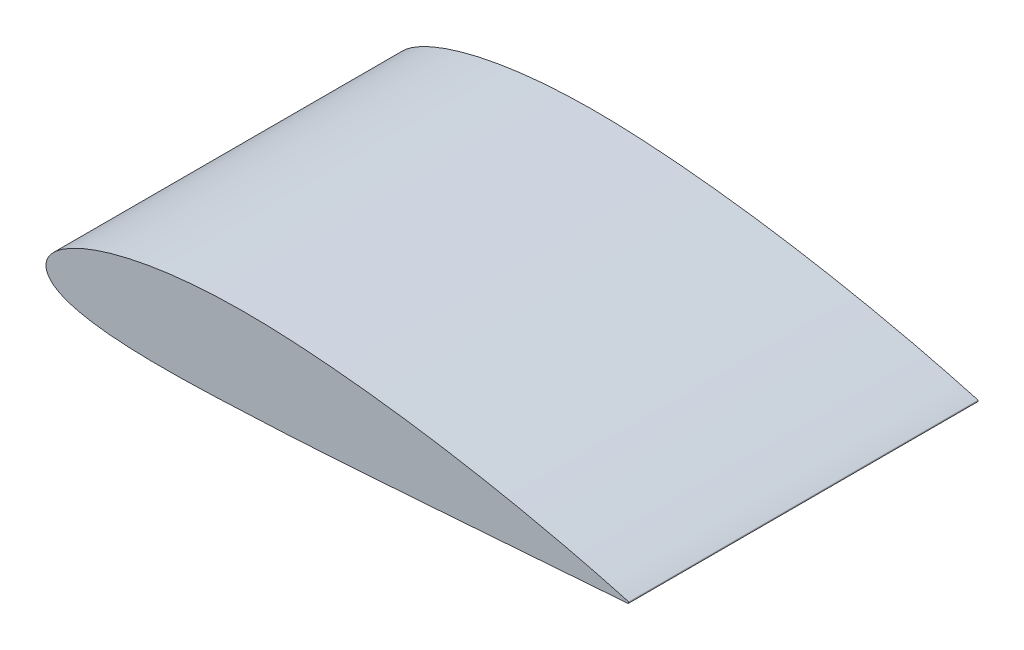
ISO-10303-21;
HEADER;
FILE_DESCRIPTION(('STEP AP214'),'2;1');
FILE_NAME('part.step','',(''),(''),'','','');
FILE_SCHEMA(('AUTOMOTIVE_DESIGN { 1 0 10303 214 1 1 1 1 }'));
ENDSEC;
DATA;
#1=APPLICATION_CONTEXT('core data for automotive mechanical design processes');
#2=APPLICATION_PROTOCOL_DEFINITION('international standard','automotive_design',2000,#1);
#3=PRODUCT_CONTEXT('',#1,'mechanical');
#4=PRODUCT('Part','Part','',(#3));
#5=PRODUCT_RELATED_PRODUCT_CATEGORY('part','',(#4));
#6=PRODUCT_DEFINITION_FORMATION('','',#4);
#7=PRODUCT_DEFINITION_CONTEXT('part definition',#1,'design');
#8=PRODUCT_DEFINITION('design','',#6,#7);
#9=PRODUCT_DEFINITION_SHAPE('','',#8);
#10=(LENGTH_UNIT() NAMED_UNIT(*) SI_UNIT(.MILLI.,.METRE.));
#11=(NAMED_UNIT(*) PLANE_ANGLE_UNIT() SI_UNIT($,.RADIAN.));
#12=(NAMED_UNIT(*) SI_UNIT($,.STERADIAN.) SOLID_ANGLE_UNIT());
#13=UNCERTAINTY_MEASURE_WITH_UNIT(LENGTH_MEASURE(1.E-05),#10,'distance_accuracy_value','');
#14=(GEOMETRIC_REPRESENTATION_CONTEXT(3) GLOBAL_UNCERTAINTY_ASSIGNED_CONTEXT((#13)) GLOBAL_UNIT_ASSIGNED_CONTEXT((#10,
#11,#12)) REPRESENTATION_CONTEXT('',''));
#15=CARTESIAN_POINT('',(0.,0.,0.));
#16=DIRECTION('',(0.,0.,1.));
#17=DIRECTION('',(1.,0.,0.));
#18=AXIS2_PLACEMENT_3D('',#15,#16,#17);
#19=CARTESIAN_POINT('',(182.405782768369,1.47905887254487,90.));
#20=CARTESIAN_POINT('',(182.394349994322,1.48372425629736,90.));
#21=CARTESIAN_POINT('',(182.344101455476,1.49405103882799,90.));
#22=CARTESIAN_POINT('',(182.236733802167,1.52728747378235,90.));
#23=CARTESIAN_POINT('',(182.054061505761,1.57563660834943,90.));
#24=CARTESIAN_POINT('',(181.800427645339,1.64672865772037,90.));
#25=CARTESIAN_POINT('',(181.473867299204,1.73599349451242,90.));
#26=CARTESIAN_POINT('',(181.07569175812,1.84544026952493,90.));
#27=CARTESIAN_POINT('',(180.605776404599,1.9734699954532,90.));
#28=CARTESIAN_POINT('',(180.064742529011,2.12060769088526,90.));
#29=CARTESIAN_POINT('',(179.452928079381,2.28555656581342,90.));
#30=CARTESIAN_POINT('',(178.770992549194,2.46856564449632,90.));
#31=CARTESIAN_POINT('',(178.019548809164,2.66877198429473,90.));
#32=CARTESIAN_POINT('',(177.199129769294,2.88536417344557,90.));
#33=CARTESIAN_POINT('',(176.310605643542,3.11833760049978,90.));
#34=CARTESIAN_POINT('',(175.354600183865,3.36641987870612,90.));
#35=CARTESIAN_POINT('',(174.332087200887,3.62933214594554,90.));
#36=CARTESIAN_POINT('',(173.244022100583,3.90615436409724,90.));
#37=CARTESIAN_POINT('',(172.091272620534,4.19600298977877,90.));
#38=CARTESIAN_POINT('',(170.874985691767,4.49841508904265,90.));
#39=CARTESIAN_POINT('',(169.596111240064,4.81203148279891,90.));
#40=CARTESIAN_POINT('',(168.255990608515,5.13673088238005,90.));
#41=CARTESIAN_POINT('',(166.855735714666,5.47093736669246,90.));
#42=CARTESIAN_POINT('',(165.39669391933,5.81436054641426,90.));
#43=CARTESIAN_POINT('',(163.880180353068,6.16579326381626,90.));
#44=CARTESIAN_POINT('',(162.307605326419,6.52454333882902,90.));
#45=CARTESIAN_POINT('',(160.680390360764,6.88936244389329,90.));
#46=CARTESIAN_POINT('',(159.000134791776,7.25974115304893,90.));
#47=CARTESIAN_POINT('',(157.268310059528,7.63442556607595,90.));
#48=CARTESIAN_POINT('',(155.486600614097,8.0126173651943,90.));
#49=CARTESIAN_POINT('',(153.656704995922,8.39340896793512,90.));
#50=CARTESIAN_POINT('',(151.780349397806,8.77598090676935,90.));
#51=CARTESIAN_POINT('',(149.859255683824,9.15904161347765,90.));
#52=CARTESIAN_POINT('',(147.895334813072,9.54219591278912,90.));
#53=CARTESIAN_POINT('',(145.89040427615,9.92412946160072,90.));
#54=CARTESIAN_POINT('',(143.846373090577,10.3039729000445,90.));
#55=CARTESIAN_POINT('',(141.765319372205,10.6812079835119,90.));
#56=CARTESIAN_POINT('',(139.649198882249,11.0543715740264,90.));
#57=CARTESIAN_POINT('',(137.500025553508,11.4226182746895,90.));
#58=CARTESIAN_POINT('',(135.319921643493,11.7855286376255,90.));
#59=CARTESIAN_POINT('',(133.110982904104,12.1418922281903,90.));
#60=CARTESIAN_POINT('',(130.875399053286,12.4906825727177,90.));
#61=CARTESIAN_POINT('',(128.615391045887,12.831174427331,90.));
#62=CARTESIAN_POINT('',(126.333137400247,13.1627236719134,90.));
#63=CARTESIAN_POINT('',(124.030878822672,13.4840714224213,90.));
#64=CARTESIAN_POINT('',(121.710956010234,13.7946426848218,90.));
#65=CARTESIAN_POINT('',(119.375684343862,14.0937283784633,90.));
#66=CARTESIAN_POINT('',(117.027363699594,14.3800866863343,90.));
#67=CARTESIAN_POINT('',(114.668319434302,14.6530947519702,90.));
#68=CARTESIAN_POINT('',(112.30103513908,14.9122826013609,90.));
#69=CARTESIAN_POINT('',(109.927737110567,15.156256099332,90.));
#70=CARTESIAN_POINT('',(107.55096560803,15.3850561259669,90.));
#71=CARTESIAN_POINT('',(105.173031682702,15.5971194086904,90.));
#72=CARTESIAN_POINT('',(102.796452216973,15.7924089941574,90.));
#73=CARTESIAN_POINT('',(100.423600801908,15.9700207397933,90.));
#74=CARTESIAN_POINT('',(98.0569177245874,16.1291368833698,90.));
#75=CARTESIAN_POINT('',(95.6988195044822,16.2693925063235,90.));
#76=CARTESIAN_POINT('',(93.3449586508391,16.3908611866141,90.));
#77=CARTESIAN_POINT('',(90.9928600278273,16.4913934499471,90.));
#78=CARTESIAN_POINT('',(88.6446894481208,16.562898483121,90.));
#79=CARTESIAN_POINT('',(86.3099312214749,16.6066549323737,90.));
#80=CARTESIAN_POINT('',(83.9958596278902,16.6219922808504,90.));
#81=CARTESIAN_POINT('',(81.7050822348194,16.6084257444218,90.));
#82=CARTESIAN_POINT('',(79.4401924537075,16.5666378978566,90.));
#83=CARTESIAN_POINT('',(77.2036900884527,16.4962234448997,90.));
#84=CARTESIAN_POINT('',(74.9981434299177,16.3972442197981,90.));
#85=CARTESIAN_POINT('',(72.8259465417015,16.2708168728597,90.));
#86=CARTESIAN_POINT('',(70.6896343419326,16.1160103431971,90.));
#87=CARTESIAN_POINT('',(68.5914531396264,15.9345619607085,90.));
#88=CARTESIAN_POINT('',(66.5338998473421,15.7259207837486,90.));
#89=CARTESIAN_POINT('',(64.5191839739808,15.4915145869629,90.));
#90=CARTESIAN_POINT('',(62.5496264703357,15.2314242833866,90.));
#91=CARTESIAN_POINT('',(60.6273129456703,14.9468451533976,90.));
#92=CARTESIAN_POINT('',(58.754400617675,14.6382647216605,90.));
#93=CARTESIAN_POINT('',(56.9329880522266,14.3069601416694,90.));
#94=CARTESIAN_POINT('',(55.1649516986086,13.9539255124746,90.));
#95=CARTESIAN_POINT('',(53.452336046637,13.5797604316655,90.));
#96=CARTESIAN_POINT('',(51.7968073296944,13.1861080557181,90.));
#97=CARTESIAN_POINT('',(50.2002168841034,12.7737056277228,90.));
#98=CARTESIAN_POINT('',(48.6641745218393,12.3440406910151,90.));
#99=CARTESIAN_POINT('',(47.190292187113,11.8981112594572,90.));
#100=CARTESIAN_POINT('',(45.7800773272546,11.4373520929544,90.));
#101=CARTESIAN_POINT('',(44.4348503719299,10.9631158583816,90.));
#102=CARTESIAN_POINT('',(43.1558843447423,10.4766727417222,90.));
#103=CARTESIAN_POINT('',(41.9445259254619,9.97905808919306,90.));
#104=CARTESIAN_POINT('',(40.8018086148333,9.47194095377795,90.));
#105=CARTESIAN_POINT('',(39.7288141175969,8.95637411153487,90.));
#106=CARTESIAN_POINT('',(38.7264399634006,8.43368601103471,90.));
#107=CARTESIAN_POINT('',(37.795433801707,7.90517984154916,90.));
#108=CARTESIAN_POINT('',(36.9367754656936,7.37175407985075,90.));
#109=CARTESIAN_POINT('',(36.1507716151831,6.83502425265779,90.));
#110=CARTESIAN_POINT('',(35.4383977276523,6.29550465004045,90.));
#111=CARTESIAN_POINT('',(34.7997262776407,5.75469005088498,90.));
#112=CARTESIAN_POINT('',(34.2357420875747,5.21280033058309,90.));
#113=CARTESIAN_POINT('',(33.7459534276668,4.67143862798895,90.));
#114=CARTESIAN_POINT('',(33.331331255168,4.13054834072201,90.));
#115=CARTESIAN_POINT('',(32.9918484981616,3.59098912624162,90.));
#116=CARTESIAN_POINT('',(32.7277381167382,3.05315284259431,90.));
#117=CARTESIAN_POINT('',(32.5398370115619,2.51729597951501,90.));
#118=CARTESIAN_POINT('',(32.4278545636237,1.98407531023235,90.));
#119=CARTESIAN_POINT('',(32.3932251684,1.45397314220587,90.));
#120=CARTESIAN_POINT('',(32.4347718188925,0.930316799243013,90.));
#121=CARTESIAN_POINT('',(32.5507287367132,0.418010144024002,90.));
#122=CARTESIAN_POINT('',(32.7410874573582,-0.0776789337837974,90.));
#123=CARTESIAN_POINT('',(33.0043989705735,-0.554000674715616,90.));
#124=CARTESIAN_POINT('',(33.3399622816249,-1.01059796074396,90.));
#125=CARTESIAN_POINT('',(33.7465429600042,-1.44760495230936,90.));
#126=CARTESIAN_POINT('',(34.223192032798,-1.86525165553163,90.));
#127=CARTESIAN_POINT('',(34.7692344511436,-2.26352437805988,90.));
#128=CARTESIAN_POINT('',(35.3838360894772,-2.6427362811952,90.));
#129=CARTESIAN_POINT('',(36.0662697842808,-3.00290223402298,90.));
#130=CARTESIAN_POINT('',(36.815561386796,-3.34444812432069,90.));
#131=CARTESIAN_POINT('',(37.6311550675631,-3.66668439689429,90.));
#132=CARTESIAN_POINT('',(38.5117978318473,-3.97044493583748,90.));
#133=CARTESIAN_POINT('',(39.4567256395094,-4.25504434487528,90.));
#134=CARTESIAN_POINT('',(40.4647771866373,-4.52089830650958,90.));
#135=CARTESIAN_POINT('',(41.5348225747301,-4.7681923310261,90.));
#136=CARTESIAN_POINT('',(42.6659548119358,-4.9962599411289,90.));
#137=CARTESIAN_POINT('',(43.8566607098284,-5.20627018661583,90.));
#138=CARTESIAN_POINT('',(45.1059475868513,-5.39745211809476,90.));
#139=CARTESIAN_POINT('',(46.4124118286755,-5.57021471062491,90.));
#140=CARTESIAN_POINT('',(47.7747607866094,-5.72531206687188,90.));
#141=CARTESIAN_POINT('',(49.1917058784171,-5.86209193731442,90.));
#142=CARTESIAN_POINT('',(50.6617821033756,-5.98141585325807,90.));
#143=CARTESIAN_POINT('',(52.183634681915,-6.08326895777644,90.));
#144=CARTESIAN_POINT('',(53.7557770896611,-6.16868025139966,90.));
#145=CARTESIAN_POINT('',(55.3768722745409,-6.23701478664602,90.));
#146=CARTESIAN_POINT('',(57.0453688675747,-6.28989038522039,90.));
#147=CARTESIAN_POINT('',(58.7597610222288,-6.3268301712314,90.));
#148=CARTESIAN_POINT('',(60.5185311270375,-6.3490073544128,90.));
#149=CARTESIAN_POINT('',(62.3200905459929,-6.35677085595247,90.));
#150=CARTESIAN_POINT('',(64.1629420543562,-6.35110924885929,90.));
#151=CARTESIAN_POINT('',(66.0454390889944,-6.33223371376637,90.));
#152=CARTESIAN_POINT('',(67.9659831892113,-6.30100972762023,90.));
#153=CARTESIAN_POINT('',(69.922927443051,-6.25828966557247,90.));
#154=CARTESIAN_POINT('',(71.9145873325607,-6.20521017511464,90.));
#155=CARTESIAN_POINT('',(73.9392916957753,-6.14176067310426,90.));
#156=CARTESIAN_POINT('',(75.9953645210405,-6.0695469488106,90.));
#157=CARTESIAN_POINT('',(78.0811113283268,-5.98941567406261,90.));
#158=CARTESIAN_POINT('',(80.1947158089128,-5.9017410027393,90.));
#159=CARTESIAN_POINT('',(82.3343976865072,-5.80779929120508,90.));
#160=CARTESIAN_POINT('',(84.4983563483147,-5.70842881461666,90.));
#161=CARTESIAN_POINT('',(86.6847860366037,-5.60440227414204,90.));
#162=CARTESIAN_POINT('',(88.8918215937709,-5.49721755431671,90.));
#163=CARTESIAN_POINT('',(91.1221934754293,-5.3861945045393,90.));
#164=CARTESIAN_POINT('',(93.3809373293886,-5.2748858411288,90.));
#165=CARTESIAN_POINT('',(95.6656033240113,-5.15570557602655,90.));
#166=CARTESIAN_POINT('',(97.9692961494487,-5.02855905234813,90.));
#167=CARTESIAN_POINT('',(100.282936029751,-4.89499859941142,90.));
#168=CARTESIAN_POINT('',(102.604336776815,-4.75506421002503,90.));
#169=CARTESIAN_POINT('',(104.931289236489,-4.61005402942719,90.));
#170=CARTESIAN_POINT('',(107.261616831131,-4.46024492739286,90.));
#171=CARTESIAN_POINT('',(109.59311004662,-4.30677527986148,90.));
#172=CARTESIAN_POINT('',(111.923457065872,-4.14938213979974,90.));
#173=CARTESIAN_POINT('',(114.250493814392,-3.98981118214582,90.));
#174=CARTESIAN_POINT('',(116.571896276663,-3.82759303753789,90.));
#175=CARTESIAN_POINT('',(118.885459207318,-3.66385612440317,90.));
#176=CARTESIAN_POINT('',(121.188975693372,-3.49906707500505,90.));
#177=CARTESIAN_POINT('',(123.480155147579,-3.33378241075414,90.));
#178=CARTESIAN_POINT('',(125.756831968788,-3.16816468510422,90.));
#179=CARTESIAN_POINT('',(128.016659727081,-3.0026937540185,90.));
#180=CARTESIAN_POINT('',(130.257517619323,-2.83814587082108,90.));
#181=CARTESIAN_POINT('',(132.477070061613,-2.67441586266764,90.));
#182=CARTESIAN_POINT('',(134.673201755833,-2.51220935588117,90.));
#183=CARTESIAN_POINT('',(136.843681591233,-2.35143667699443,90.));
#184=CARTESIAN_POINT('',(138.986384511423,-2.19271843567201,90.));
#185=CARTESIAN_POINT('',(141.099168581397,-2.03639814611991,90.));
#186=CARTESIAN_POINT('',(143.179855371109,-1.88227813634571,90.));
#187=CARTESIAN_POINT('',(145.226420998986,-1.73084926152063,90.));
#188=CARTESIAN_POINT('',(147.236750957427,-1.58215052238198,90.));
#189=CARTESIAN_POINT('',(149.208856383404,-1.4365190386133,90.));
#190=CARTESIAN_POINT('',(151.140655074855,-1.29428623860292,90.));
#191=CARTESIAN_POINT('',(153.030192457164,-1.15484985652425,90.));
#192=CARTESIAN_POINT('',(154.875543451983,-1.01926820831526,90.));
#193=CARTESIAN_POINT('',(156.674783400005,-0.886762566630141,90.));
#194=CARTESIAN_POINT('',(158.426142878185,-0.75842220124745,90.));
#195=CARTESIAN_POINT('',(160.127749642846,-0.633402544099525,90.));
#196=CARTESIAN_POINT('',(161.777845477469,-0.512314268818079,90.));
#197=CARTESIAN_POINT('',(163.374678149992,-0.395266255336201,90.));
#198=CARTESIAN_POINT('',(164.916632103398,-0.282137449146016,90.));
#199=CARTESIAN_POINT('',(166.402089910074,-0.173365532258105,90.));
#200=CARTESIAN_POINT('',(167.829445211781,-0.0683225122333148,90.));
#201=CARTESIAN_POINT('',(169.197218485784,0.0319889479677395,90.));
#202=CARTESIAN_POINT('',(170.503959777255,0.128108776961527,90.));
#203=CARTESIAN_POINT('',(171.748287502294,0.219742687175725,90.));
#204=CARTESIAN_POINT('',(172.928858392526,0.306707433134587,90.));
#205=CARTESIAN_POINT('',(174.044466762563,0.389036498311459,90.));
#206=CARTESIAN_POINT('',(175.093851343769,0.466789310490436,90.));
#207=CARTESIAN_POINT('',(176.075925967201,0.539636799673912,90.));
#208=CARTESIAN_POINT('',(176.98956759388,0.60717244757744,90.));
#209=CARTESIAN_POINT('',(177.833807521251,0.670226400555756,90.));
#210=CARTESIAN_POINT('',(178.60776376818,0.727840711118289,90.));
#211=CARTESIAN_POINT('',(179.310607993813,0.780246384431353,90.));
#212=CARTESIAN_POINT('',(179.941538554297,0.8274437321025,90.));
#213=CARTESIAN_POINT('',(180.499910824403,0.869238085863767,90.));
#214=CARTESIAN_POINT('',(180.985098553037,0.905500300854232,90.));
#215=CARTESIAN_POINT('',(181.396454012276,0.936746093248576,90.));
#216=CARTESIAN_POINT('',(181.733783179907,0.961529390087132,90.));
#217=CARTESIAN_POINT('',(181.996190142957,0.982403012266567,90.));
#218=CARTESIAN_POINT('',(182.184646910588,0.994514217153418,90.));
#219=CARTESIAN_POINT('',(182.296378717231,1.006172264147,90.));
#220=CARTESIAN_POINT('',(182.507969908863,1.00828975623538,90.));
#221=CARTESIAN_POINT('',(182.548488653316,1.42082473669181,90.));
#222=CARTESIAN_POINT('',(182.405782768369,1.47905887254487,90.));
#223=B_SPLINE_CURVE_WITH_KNOTS('',3,(#19,#20,#21,#22,#23,#24,#25,#26,#27,#28,#29,#30,#31,#32,
#33,#34,#35,#36,#37,#38,#39,#40,#41,#42,#43,#44,#45,#46,#47,#48,#49,#50,#51,#52,#53,#54,#55,#56,
#57,#58,#59,#60,#61,#62,#63,#64,#65,#66,#67,#68,#69,#70,#71,#72,#73,#74,#75,#76,#77,#78,#79,#80,
#81,#82,#83,#84,#85,#86,#87,#88,#89,#90,#91,#92,#93,#94,#95,#96,#97,#98,#99,#100,#101,#102,#103,
#104,#105,#106,#107,#108,#109,#110,#111,#112,#113,#114,#115,#116,#117,#118,#119,#120,#121,#122,
#123,#124,#125,#126,#127,#128,#129,#130,#131,#132,#133,#134,#135,#136,#137,#138,#139,#140,#141,
#142,#143,#144,#145,#146,#147,#148,#149,#150,#151,#152,#153,#154,#155,#156,#157,#158,#159,#160,
#161,#162,#163,#164,#165,#166,#167,#168,#169,#170,#171,#172,#173,#174,#175,#176,#177,#178,#179,
#180,#181,#182,#183,#184,#185,#186,#187,#188,#189,#190,#191,#192,#193,#194,#195,#196,#197,#198,
#199,#200,#201,#202,#203,#204,#205,#206,#207,#208,#209,#210,#211,#212,#213,#214,#215,#216,#217,
#218,#219,#220,#221,#222),.UNSPECIFIED.,.T.,.F.,(4,1,1,1,1,1,1,1,1,1,1,1,1,1,1,1,1,1,1,1,1,1,1,
1,1,1,1,1,1,1,1,1,1,1,1,1,1,1,1,1,1,1,1,1,1,1,1,1,1,1,1,1,1,1,1,1,1,1,1,1,1,1,1,1,1,1,1,1,1,1,1,
1,1,1,1,1,1,1,1,1,1,1,1,1,1,1,1,1,1,1,1,1,1,1,1,1,1,1,1,1,1,1,1,1,1,1,1,1,1,1,1,1,1,1,1,1,1,1,1,
1,1,1,1,1,1,1,1,1,1,1,1,1,1,1,1,1,1,1,1,1,1,1,1,1,1,1,1,1,1,1,1,1,1,1,1,1,1,1,1,1,1,1,1,1,1,1,1,
1,1,1,1,1,1,1,1,1,1,1,1,1,1,1,1,1,1,1,1,1,1,1,1,1,1,1,1,1,1,1,1,1,1,4),(0.,0.000122232156671038,
0.000487865178424009,0.00109676904322384,0.0019490737711047,0.00304286050149934,
0.00437719652869453,0.00595169618080799,0.00776330233362274,0.00981150703060034,
0.01209325652869,0.0146066481533345,0.0173487240984786,0.0203173736843586,0.0235095264159308,
0.0269214286738878,0.0305501483194694,0.0343912345418025,0.0384418921705454,0.0426975719441291,
0.0471536145832565,0.0518064350430086,0.0566503347321968,0.0616813961272436,0.0668942999562323,
0.0722836314743028,0.0778442037193446,0.0835706302198826,0.0894571712152603,0.0954976256776925,
0.101686279243883,0.108017335930094,0.114483782402449,0.12107985495461,0.127798950174002,
0.134634090681022,0.141578528833939,0.148625236139389,0.155767840034503,0.162999260945411,
0.170311489208925,0.177697645479067,0.185150865560018,0.192663686138765,0.200227847390306,
0.207836547042326,0.215482404345253,0.223156748670417,0.23085339191479,0.238563605431291,
0.246280341988535,0.253995908798867,0.261702347858507,0.269392126506708,0.277058237126498,
0.284692327915629,0.292287498468027,0.299902510552048,0.307509761464842,0.315056461974571,
0.322534970119633,0.329938173281678,0.337258997467649,0.344489933065444,0.351624953286885,
0.358656540789691,0.365578309819993,0.372384176448118,0.379067784090073,0.385622108090212,
0.392042228628359,0.398322121290024,0.404455854917232,0.410438810544571,0.416264476234677,
0.42192942801804,0.427428463107383,0.432756630558136,0.437910804274232,0.442886519197732,
0.447680186591247,0.452288761255866,0.456709931569072,0.460941108182909,0.464979990428142,
0.468825340969396,0.472477126331182,0.475934625259071,0.479198965713929,0.482271842921973,
0.485156202569375,0.487856333816395,0.490378515536502,0.492731261456273,0.494925425892168,
0.496975704551434,0.498899901329195,0.50072066709355,0.50246521263008,0.50416437968869,
0.505851716627391,0.507539073869272,0.509237792817912,0.51098091937154,0.512798413722822,
0.51471614811643,0.516754845032538,0.518931444972203,0.521259199410513,0.523748295677471,
0.52640558337279,0.529236449978548,0.532244612443317,0.535431872216937,0.538799073332439,
0.542347180004487,0.546074806379783,0.549981607712584,0.554064834100805,0.558323172433578,
0.56275361304959,0.567353631282113,0.572119753835235,0.577048267874352,0.582136328776736,
0.587379391684695,0.592773901426197,0.598315609299946,0.603999263305867,0.609821442055273,
0.615776708553658,0.621860524968747,0.628067807237556,0.634393402925607,0.640832101539103,
0.647378200967991,0.654026862702553,0.660772267422934,0.667608603420863,0.67452998033676,
0.681530504119134,0.688604263607131,0.695745311800452,0.702946791729336,0.710248291477199,
0.717664119016874,0.725120353474307,0.732610151549913,0.740125742118758,0.747660709209389,
0.755207230187697,0.762758409951436,0.770306954826123,0.777844924319403,0.785365530183352,
0.792861367905112,0.800324577923374,0.80774878105923,0.815125697581578,0.822448945494078,
0.829710174283397,0.836903068729489,0.84401979469392,0.851053553411115,0.857997476512324,
0.86484424714456,0.871587101133048,0.878219204787367,0.884734242343513,0.891124897043693,
0.897385336384049,0.903508347512933,0.909488511859361,0.915319099621347,0.920994209241364,
0.926508594747205,0.931855905924901,0.93703031020784,0.942026975807509,0.946841036507678,
0.951466245451372,0.955898633839387,0.960133404410368,0.964165690967569,0.967991593614961,
0.97160676388749,0.975007819778442,0.978190343456263,0.981151401212671,0.983887197646505,
0.986395695490825,0.988673512780112,0.990718233878383,0.99252789119387,0.994100552235253,
0.995433801486359,0.996526602125623,0.997378058616699,0.99798709869111,0.99835234356508,
0.998474276845203,1.),.UNSPECIFIED.);
#224=DIRECTION('',(0.,0.,-1.));
#225=VECTOR('',#224,1.);
#226=SURFACE_OF_LINEAR_EXTRUSION('',#223,#225);
#227=CARTESIAN_POINT('',(182.405782768369,1.47905887254487,90.));
#228=VERTEX_POINT('',#227);
#229=EDGE_CURVE('E10',#228,#228,#223,.T.);
#230=ORIENTED_EDGE('',*,*,#229,.F.);
#231=EDGE_LOOP('',(#230));
#232=FACE_BOUND('',#231,.T.);
#233=CARTESIAN_POINT('',(182.405782768369,1.47905887254487,0.));
#234=CARTESIAN_POINT('',(182.394349994322,1.48372425629736,0.));
#235=CARTESIAN_POINT('',(182.344101455476,1.49405103882799,0.));
#236=CARTESIAN_POINT('',(182.236733802167,1.52728747378235,0.));
#237=CARTESIAN_POINT('',(182.054061505761,1.57563660834943,0.));
#238=CARTESIAN_POINT('',(181.800427645339,1.64672865772037,0.));
#239=CARTESIAN_POINT('',(181.473867299204,1.73599349451242,0.));
#240=CARTESIAN_POINT('',(181.07569175812,1.84544026952493,0.));
#241=CARTESIAN_POINT('',(180.605776404599,1.9734699954532,0.));
#242=CARTESIAN_POINT('',(180.064742529011,2.12060769088526,0.));
#243=CARTESIAN_POINT('',(179.452928079381,2.28555656581342,0.));
#244=CARTESIAN_POINT('',(178.770992549194,2.46856564449632,0.));
#245=CARTESIAN_POINT('',(178.019548809164,2.66877198429473,0.));
#246=CARTESIAN_POINT('',(177.199129769294,2.88536417344557,0.));
#247=CARTESIAN_POINT('',(176.310605643542,3.11833760049978,0.));
#248=CARTESIAN_POINT('',(175.354600183865,3.36641987870612,0.));
#249=CARTESIAN_POINT('',(174.332087200887,3.62933214594554,0.));
#250=CARTESIAN_POINT('',(173.244022100583,3.90615436409724,0.));
#251=CARTESIAN_POINT('',(172.091272620534,4.19600298977877,0.));
#252=CARTESIAN_POINT('',(170.874985691767,4.49841508904265,0.));
#253=CARTESIAN_POINT('',(169.596111240064,4.81203148279891,0.));
#254=CARTESIAN_POINT('',(168.255990608515,5.13673088238005,0.));
#255=CARTESIAN_POINT('',(166.855735714666,5.47093736669246,0.));
#256=CARTESIAN_POINT('',(165.39669391933,5.81436054641426,0.));
#257=CARTESIAN_POINT('',(163.880180353068,6.16579326381626,0.));
#258=CARTESIAN_POINT('',(162.307605326419,6.52454333882902,0.));
#259=CARTESIAN_POINT('',(160.680390360764,6.88936244389329,0.));
#260=CARTESIAN_POINT('',(159.000134791776,7.25974115304893,0.));
#261=CARTESIAN_POINT('',(157.268310059528,7.63442556607595,0.));
#262=CARTESIAN_POINT('',(155.486600614097,8.0126173651943,0.));
#263=CARTESIAN_POINT('',(153.656704995922,8.39340896793512,0.));
#264=CARTESIAN_POINT('',(151.780349397806,8.77598090676935,0.));
#265=CARTESIAN_POINT('',(149.859255683824,9.15904161347765,0.));
#266=CARTESIAN_POINT('',(147.895334813072,9.54219591278912,0.));
#267=CARTESIAN_POINT('',(145.89040427615,9.92412946160072,0.));
#268=CARTESIAN_POINT('',(143.846373090577,10.3039729000445,0.));
#269=CARTESIAN_POINT('',(141.765319372205,10.6812079835119,0.));
#270=CARTESIAN_POINT('',(139.649198882249,11.0543715740264,0.));
#271=CARTESIAN_POINT('',(137.500025553508,11.4226182746895,0.));
#272=CARTESIAN_POINT('',(135.319921643493,11.7855286376255,0.));
#273=CARTESIAN_POINT('',(133.110982904104,12.1418922281903,0.));
#274=CARTESIAN_POINT('',(130.875399053286,12.4906825727177,0.));
#275=CARTESIAN_POINT('',(128.615391045887,12.831174427331,0.));
#276=CARTESIAN_POINT('',(126.333137400247,13.1627236719134,0.));
#277=CARTESIAN_POINT('',(124.030878822672,13.4840714224213,0.));
#278=CARTESIAN_POINT('',(121.710956010234,13.7946426848218,0.));
#279=CARTESIAN_POINT('',(119.375684343862,14.0937283784633,0.));
#280=CARTESIAN_POINT('',(117.027363699594,14.3800866863343,0.));
#281=CARTESIAN_POINT('',(114.668319434302,14.6530947519702,0.));
#282=CARTESIAN_POINT('',(112.30103513908,14.9122826013609,0.));
#283=CARTESIAN_POINT('',(109.927737110567,15.156256099332,0.));
#284=CARTESIAN_POINT('',(107.55096560803,15.3850561259669,0.));
#285=CARTESIAN_POINT('',(105.173031682702,15.5971194086904,0.));
#286=CARTESIAN_POINT('',(102.796452216973,15.7924089941574,0.));
#287=CARTESIAN_POINT('',(100.423600801908,15.9700207397933,0.));
#288=CARTESIAN_POINT('',(98.0569177245874,16.1291368833698,0.));
#289=CARTESIAN_POINT('',(95.6988195044822,16.2693925063235,0.));
#290=CARTESIAN_POINT('',(93.3449586508391,16.3908611866141,0.));
#291=CARTESIAN_POINT('',(90.9928600278273,16.4913934499471,0.));
#292=CARTESIAN_POINT('',(88.6446894481208,16.562898483121,0.));
#293=CARTESIAN_POINT('',(86.3099312214749,16.6066549323737,0.));
#294=CARTESIAN_POINT('',(83.9958596278902,16.6219922808504,0.));
#295=CARTESIAN_POINT('',(81.7050822348194,16.6084257444218,0.));
#296=CARTESIAN_POINT('',(79.4401924537075,16.5666378978566,0.));
#297=CARTESIAN_POINT('',(77.2036900884527,16.4962234448997,0.));
#298=CARTESIAN_POINT('',(74.9981434299177,16.3972442197981,0.));
#299=CARTESIAN_POINT('',(72.8259465417015,16.2708168728597,0.));
#300=CARTESIAN_POINT('',(70.6896343419326,16.1160103431971,0.));
#301=CARTESIAN_POINT('',(68.5914531396264,15.9345619607085,0.));
#302=CARTESIAN_POINT('',(66.5338998473421,15.7259207837486,0.));
#303=CARTESIAN_POINT('',(64.5191839739808,15.4915145869629,0.));
#304=CARTESIAN_POINT('',(62.5496264703357,15.2314242833866,0.));
#305=CARTESIAN_POINT('',(60.6273129456703,14.9468451533976,0.));
#306=CARTESIAN_POINT('',(58.754400617675,14.6382647216605,0.));
#307=CARTESIAN_POINT('',(56.9329880522266,14.3069601416694,0.));
#308=CARTESIAN_POINT('',(55.1649516986086,13.9539255124746,0.));
#309=CARTESIAN_POINT('',(53.452336046637,13.5797604316655,0.));
#310=CARTESIAN_POINT('',(51.7968073296944,13.1861080557181,0.));
#311=CARTESIAN_POINT('',(50.2002168841034,12.7737056277228,0.));
#312=CARTESIAN_POINT('',(48.6641745218393,12.3440406910151,0.));
#313=CARTESIAN_POINT('',(47.190292187113,11.8981112594572,0.));
#314=CARTESIAN_POINT('',(45.7800773272546,11.4373520929544,0.));
#315=CARTESIAN_POINT('',(44.4348503719299,10.9631158583816,0.));
#316=CARTESIAN_POINT('',(43.1558843447423,10.4766727417222,0.));
#317=CARTESIAN_POINT('',(41.9445259254619,9.97905808919306,0.));
#318=CARTESIAN_POINT('',(40.8018086148333,9.47194095377795,0.));
#319=CARTESIAN_POINT('',(39.7288141175969,8.95637411153487,0.));
#320=CARTESIAN_POINT('',(38.7264399634006,8.43368601103471,0.));
#321=CARTESIAN_POINT('',(37.795433801707,7.90517984154916,0.));
#322=CARTESIAN_POINT('',(36.9367754656936,7.37175407985075,0.));
#323=CARTESIAN_POINT('',(36.1507716151831,6.83502425265779,0.));
#324=CARTESIAN_POINT('',(35.4383977276523,6.29550465004045,0.));
#325=CARTESIAN_POINT('',(34.7997262776407,5.75469005088498,0.));
#326=CARTESIAN_POINT('',(34.2357420875747,5.21280033058309,0.));
#327=CARTESIAN_POINT('',(33.7459534276668,4.67143862798895,0.));
#328=CARTESIAN_POINT('',(33.331331255168,4.13054834072201,0.));
#329=CARTESIAN_POINT('',(32.9918484981616,3.59098912624162,0.));
#330=CARTESIAN_POINT('',(32.7277381167382,3.05315284259431,0.));
#331=CARTESIAN_POINT('',(32.5398370115619,2.51729597951501,0.));
#332=CARTESIAN_POINT('',(32.4278545636237,1.98407531023235,0.));
#333=CARTESIAN_POINT('',(32.3932251684,1.45397314220587,0.));
#334=CARTESIAN_POINT('',(32.4347718188925,0.930316799243013,0.));
#335=CARTESIAN_POINT('',(32.5507287367132,0.418010144024002,0.));
#336=CARTESIAN_POINT('',(32.7410874573582,-0.0776789337837974,0.));
#337=CARTESIAN_POINT('',(33.0043989705735,-0.554000674715616,0.));
#338=CARTESIAN_POINT('',(33.3399622816249,-1.01059796074396,0.));
#339=CARTESIAN_POINT('',(33.7465429600042,-1.44760495230936,0.));
#340=CARTESIAN_POINT('',(34.223192032798,-1.86525165553163,0.));
#341=CARTESIAN_POINT('',(34.7692344511436,-2.26352437805988,0.));
#342=CARTESIAN_POINT('',(35.3838360894772,-2.6427362811952,0.));
#343=CARTESIAN_POINT('',(36.0662697842808,-3.00290223402298,0.));
#344=CARTESIAN_POINT('',(36.815561386796,-3.34444812432069,0.));
#345=CARTESIAN_POINT('',(37.6311550675631,-3.66668439689429,0.));
#346=CARTESIAN_POINT('',(38.5117978318473,-3.97044493583748,0.));
#347=CARTESIAN_POINT('',(39.4567256395094,-4.25504434487528,0.));
#348=CARTESIAN_POINT('',(40.4647771866373,-4.52089830650958,0.));
#349=CARTESIAN_POINT('',(41.5348225747301,-4.7681923310261,0.));
#350=CARTESIAN_POINT('',(42.6659548119358,-4.9962599411289,0.));
#351=CARTESIAN_POINT('',(43.8566607098284,-5.20627018661583,0.));
#352=CARTESIAN_POINT('',(45.1059475868513,-5.39745211809476,0.));
#353=CARTESIAN_POINT('',(46.4124118286755,-5.57021471062491,0.));
#354=CARTESIAN_POINT('',(47.7747607866094,-5.72531206687188,0.));
#355=CARTESIAN_POINT('',(49.1917058784171,-5.86209193731442,0.));
#356=CARTESIAN_POINT('',(50.6617821033756,-5.98141585325807,0.));
#357=CARTESIAN_POINT('',(52.183634681915,-6.08326895777644,0.));
#358=CARTESIAN_POINT('',(53.7557770896611,-6.16868025139966,0.));
#359=CARTESIAN_POINT('',(55.3768722745409,-6.23701478664602,0.));
#360=CARTESIAN_POINT('',(57.0453688675747,-6.28989038522039,0.));
#361=CARTESIAN_POINT('',(58.7597610222288,-6.3268301712314,0.));
#362=CARTESIAN_POINT('',(60.5185311270375,-6.3490073544128,0.));
#363=CARTESIAN_POINT('',(62.3200905459929,-6.35677085595247,0.));
#364=CARTESIAN_POINT('',(64.1629420543562,-6.35110924885929,0.));
#365=CARTESIAN_POINT('',(66.0454390889944,-6.33223371376637,0.));
#366=CARTESIAN_POINT('',(67.9659831892113,-6.30100972762023,0.));
#367=CARTESIAN_POINT('',(69.922927443051,-6.25828966557247,0.));
#368=CARTESIAN_POINT('',(71.9145873325607,-6.20521017511464,0.));
#369=CARTESIAN_POINT('',(73.9392916957753,-6.14176067310426,0.));
#370=CARTESIAN_POINT('',(75.9953645210405,-6.0695469488106,0.));
#371=CARTESIAN_POINT('',(78.0811113283268,-5.98941567406261,0.));
#372=CARTESIAN_POINT('',(80.1947158089128,-5.9017410027393,0.));
#373=CARTESIAN_POINT('',(82.3343976865072,-5.80779929120508,0.));
#374=CARTESIAN_POINT('',(84.4983563483147,-5.70842881461666,0.));
#375=CARTESIAN_POINT('',(86.6847860366037,-5.60440227414204,0.));
#376=CARTESIAN_POINT('',(88.8918215937709,-5.49721755431671,0.));
#377=CARTESIAN_POINT('',(91.1221934754293,-5.3861945045393,0.));
#378=CARTESIAN_POINT('',(93.3809373293886,-5.2748858411288,0.));
#379=CARTESIAN_POINT('',(95.6656033240113,-5.15570557602655,0.));
#380=CARTESIAN_POINT('',(97.9692961494487,-5.02855905234813,0.));
#381=CARTESIAN_POINT('',(100.282936029751,-4.89499859941142,0.));
#382=CARTESIAN_POINT('',(102.604336776815,-4.75506421002503,0.));
#383=CARTESIAN_POINT('',(104.931289236489,-4.61005402942719,0.));
#384=CARTESIAN_POINT('',(107.261616831131,-4.46024492739286,0.));
#385=CARTESIAN_POINT('',(109.59311004662,-4.30677527986148,0.));
#386=CARTESIAN_POINT('',(111.923457065872,-4.14938213979974,0.));
#387=CARTESIAN_POINT('',(114.250493814392,-3.98981118214582,0.));
#388=CARTESIAN_POINT('',(116.571896276663,-3.82759303753789,0.));
#389=CARTESIAN_POINT('',(118.885459207318,-3.66385612440317,0.));
#390=CARTESIAN_POINT('',(121.188975693372,-3.49906707500505,0.));
#391=CARTESIAN_POINT('',(123.480155147579,-3.33378241075414,0.));
#392=CARTESIAN_POINT('',(125.756831968788,-3.16816468510422,0.));
#393=CARTESIAN_POINT('',(128.016659727081,-3.0026937540185,0.));
#394=CARTESIAN_POINT('',(130.257517619323,-2.83814587082108,0.));
#395=CARTESIAN_POINT('',(132.477070061613,-2.67441586266764,0.));
#396=CARTESIAN_POINT('',(134.673201755833,-2.51220935588117,0.));
#397=CARTESIAN_POINT('',(136.843681591233,-2.35143667699443,0.));
#398=CARTESIAN_POINT('',(138.986384511423,-2.19271843567201,0.));
#399=CARTESIAN_POINT('',(141.099168581397,-2.03639814611991,0.));
#400=CARTESIAN_POINT('',(143.179855371109,-1.88227813634571,0.));
#401=CARTESIAN_POINT('',(145.226420998986,-1.73084926152063,0.));
#402=CARTESIAN_POINT('',(147.236750957427,-1.58215052238198,0.));
#403=CARTESIAN_POINT('',(149.208856383404,-1.4365190386133,0.));
#404=CARTESIAN_POINT('',(151.140655074855,-1.29428623860292,0.));
#405=CARTESIAN_POINT('',(153.030192457164,-1.15484985652425,0.));
#406=CARTESIAN_POINT('',(154.875543451983,-1.01926820831526,0.));
#407=CARTESIAN_POINT('',(156.674783400005,-0.886762566630141,0.));
#408=CARTESIAN_POINT('',(158.426142878185,-0.75842220124745,0.));
#409=CARTESIAN_POINT('',(160.127749642846,-0.633402544099525,0.));
#410=CARTESIAN_POINT('',(161.777845477469,-0.512314268818079,0.));
#411=CARTESIAN_POINT('',(163.374678149992,-0.395266255336201,0.));
#412=CARTESIAN_POINT('',(164.916632103398,-0.282137449146016,0.));
#413=CARTESIAN_POINT('',(166.402089910074,-0.173365532258105,0.));
#414=CARTESIAN_POINT('',(167.829445211781,-0.0683225122333148,0.));
#415=CARTESIAN_POINT('',(169.197218485784,0.0319889479677395,0.));
#416=CARTESIAN_POINT('',(170.503959777255,0.128108776961527,0.));
#417=CARTESIAN_POINT('',(171.748287502294,0.219742687175725,0.));
#418=CARTESIAN_POINT('',(172.928858392526,0.306707433134587,0.));
#419=CARTESIAN_POINT('',(174.044466762563,0.389036498311459,0.));
#420=CARTESIAN_POINT('',(175.093851343769,0.466789310490436,0.));
#421=CARTESIAN_POINT('',(176.075925967201,0.539636799673912,0.));
#422=CARTESIAN_POINT('',(176.98956759388,0.60717244757744,0.));
#423=CARTESIAN_POINT('',(177.833807521251,0.670226400555756,0.));
#424=CARTESIAN_POINT('',(178.60776376818,0.727840711118289,0.));
#425=CARTESIAN_POINT('',(179.310607993813,0.780246384431353,0.));
#426=CARTESIAN_POINT('',(179.941538554297,0.8274437321025,0.));
#427=CARTESIAN_POINT('',(180.499910824403,0.869238085863767,0.));
#428=CARTESIAN_POINT('',(180.985098553037,0.905500300854232,0.));
#429=CARTESIAN_POINT('',(181.396454012276,0.936746093248576,0.));
#430=CARTESIAN_POINT('',(181.733783179907,0.961529390087132,0.));
#431=CARTESIAN_POINT('',(181.996190142957,0.982403012266567,0.));
#432=CARTESIAN_POINT('',(182.184646910588,0.994514217153418,0.));
#433=CARTESIAN_POINT('',(182.296378717231,1.006172264147,0.));
#434=CARTESIAN_POINT('',(182.507969908863,1.00828975623538,0.));
#435=CARTESIAN_POINT('',(182.548488653316,1.42082473669181,0.));
#436=CARTESIAN_POINT('',(182.405782768369,1.47905887254487,0.));
#437=B_SPLINE_CURVE_WITH_KNOTS('',3,(#233,#234,#235,#236,#237,#238,#239,#240,#241,#242,#243,
#244,#245,#246,#247,#248,#249,#250,#251,#252,#253,#254,#255,#256,#257,#258,#259,#260,#261,#262,
#263,#264,#265,#266,#267,#268,#269,#270,#271,#272,#273,#274,#275,#276,#277,#278,#279,#280,#281,
#282,#283,#284,#285,#286,#287,#288,#289,#290,#291,#292,#293,#294,#295,#296,#297,#298,#299,#300,
#301,#302,#303,#304,#305,#306,#307,#308,#309,#310,#311,#312,#313,#314,#315,#316,#317,#318,#319,
#320,#321,#322,#323,#324,#325,#326,#327,#328,#329,#330,#331,#332,#333,#334,#335,#336,#337,#338,
#339,#340,#341,#342,#343,#344,#345,#346,#347,#348,#349,#350,#351,#352,#353,#354,#355,#356,#357,
#358,#359,#360,#361,#362,#363,#364,#365,#366,#367,#368,#369,#370,#371,#372,#373,#374,#375,#376,
#377,#378,#379,#380,#381,#382,#383,#384,#385,#386,#387,#388,#389,#390,#391,#392,#393,#394,#395,
#396,#397,#398,#399,#400,#401,#402,#403,#404,#405,#406,#407,#408,#409,#410,#411,#412,#413,#414,
#415,#416,#417,#418,#419,#420,#421,#422,#423,#424,#425,#426,#427,#428,#429,#430,#431,#432,#433,
#434,#435,#436),.UNSPECIFIED.,.T.,.F.,(4,1,1,1,1,1,1,1,1,1,1,1,1,1,1,1,1,1,1,1,1,1,1,1,1,1,1,1,
1,1,1,1,1,1,1,1,1,1,1,1,1,1,1,1,1,1,1,1,1,1,1,1,1,1,1,1,1,1,1,1,1,1,1,1,1,1,1,1,1,1,1,1,1,1,1,1,
1,1,1,1,1,1,1,1,1,1,1,1,1,1,1,1,1,1,1,1,1,1,1,1,1,1,1,1,1,1,1,1,1,1,1,1,1,1,1,1,1,1,1,1,1,1,1,1,
1,1,1,1,1,1,1,1,1,1,1,1,1,1,1,1,1,1,1,1,1,1,1,1,1,1,1,1,1,1,1,1,1,1,1,1,1,1,1,1,1,1,1,1,1,1,1,1,
1,1,1,1,1,1,1,1,1,1,1,1,1,1,1,1,1,1,1,1,1,1,1,1,1,1,1,1,1,4),(0.,0.000122232156671038,
0.000487865178424009,0.00109676904322384,0.0019490737711047,0.00304286050149934,
0.00437719652869453,0.00595169618080799,0.00776330233362274,0.00981150703060034,
0.01209325652869,0.0146066481533345,0.0173487240984786,0.0203173736843586,0.0235095264159308,
0.0269214286738878,0.0305501483194694,0.0343912345418025,0.0384418921705454,0.0426975719441291,
0.0471536145832565,0.0518064350430086,0.0566503347321968,0.0616813961272436,0.0668942999562323,
0.0722836314743028,0.0778442037193446,0.0835706302198826,0.0894571712152603,0.0954976256776925,
0.101686279243883,0.108017335930094,0.114483782402449,0.12107985495461,0.127798950174002,
0.134634090681022,0.141578528833939,0.148625236139389,0.155767840034503,0.162999260945411,
0.170311489208925,0.177697645479067,0.185150865560018,0.192663686138765,0.200227847390306,
0.207836547042326,0.215482404345253,0.223156748670417,0.23085339191479,0.238563605431291,
0.246280341988535,0.253995908798867,0.261702347858507,0.269392126506708,0.277058237126498,
0.284692327915629,0.292287498468027,0.299902510552048,0.307509761464842,0.315056461974571,
0.322534970119633,0.329938173281678,0.337258997467649,0.344489933065444,0.351624953286885,
0.358656540789691,0.365578309819993,0.372384176448118,0.379067784090073,0.385622108090212,
0.392042228628359,0.398322121290024,0.404455854917232,0.410438810544571,0.416264476234677,
0.42192942801804,0.427428463107383,0.432756630558136,0.437910804274232,0.442886519197732,
0.447680186591247,0.452288761255866,0.456709931569072,0.460941108182909,0.464979990428142,
0.468825340969396,0.472477126331182,0.475934625259071,0.479198965713929,0.482271842921973,
0.485156202569375,0.487856333816395,0.490378515536502,0.492731261456273,0.494925425892168,
0.496975704551434,0.498899901329195,0.50072066709355,0.50246521263008,0.50416437968869,
0.505851716627391,0.507539073869272,0.509237792817912,0.51098091937154,0.512798413722822,
0.51471614811643,0.516754845032538,0.518931444972203,0.521259199410513,0.523748295677471,
0.52640558337279,0.529236449978548,0.532244612443317,0.535431872216937,0.538799073332439,
0.542347180004487,0.546074806379783,0.549981607712584,0.554064834100805,0.558323172433578,
0.56275361304959,0.567353631282113,0.572119753835235,0.577048267874352,0.582136328776736,
0.587379391684695,0.592773901426197,0.598315609299946,0.603999263305867,0.609821442055273,
0.615776708553658,0.621860524968747,0.628067807237556,0.634393402925607,0.640832101539103,
0.647378200967991,0.654026862702553,0.660772267422934,0.667608603420863,0.67452998033676,
0.681530504119134,0.688604263607131,0.695745311800452,0.702946791729336,0.710248291477199,
0.717664119016874,0.725120353474307,0.732610151549913,0.740125742118758,0.747660709209389,
0.755207230187697,0.762758409951436,0.770306954826123,0.777844924319403,0.785365530183352,
0.792861367905112,0.800324577923374,0.80774878105923,0.815125697581578,0.822448945494078,
0.829710174283397,0.836903068729489,0.84401979469392,0.851053553411115,0.857997476512324,
0.86484424714456,0.871587101133048,0.878219204787367,0.884734242343513,0.891124897043693,
0.897385336384049,0.903508347512933,0.909488511859361,0.915319099621347,0.920994209241364,
0.926508594747205,0.931855905924901,0.93703031020784,0.942026975807509,0.946841036507678,
0.951466245451372,0.955898633839387,0.960133404410368,0.964165690967569,0.967991593614961,
0.97160676388749,0.975007819778442,0.978190343456263,0.981151401212671,0.983887197646505,
0.986395695490825,0.988673512780112,0.990718233878383,0.99252789119387,0.994100552235253,
0.995433801486359,0.996526602125623,0.997378058616699,0.99798709869111,0.99835234356508,
0.998474276845203,1.),.UNSPECIFIED.);
#438=CARTESIAN_POINT('',(182.405782768369,1.47905887254487,0.));
#439=VERTEX_POINT('',#438);
#440=EDGE_CURVE('E47',#439,#439,#437,.T.);
#441=ORIENTED_EDGE('',*,*,#440,.T.);
#442=EDGE_LOOP('',(#441));
#443=FACE_BOUND('',#442,.T.);
#444=ADVANCED_FACE('F43',(#232,#443),#226,.F.);
#445=CARTESIAN_POINT('',(32.6145117139718,2.71988196779445,90.));
#446=DIRECTION('',(0.,0.,-1.));
#447=DIRECTION('',(-1.,0.,0.));
#448=AXIS2_PLACEMENT_3D('',#445,#446,#447);
#449=PLANE('',#448);
#450=ORIENTED_EDGE('',*,*,#229,.T.);
#451=EDGE_LOOP('',(#450));
#452=FACE_BOUND('',#451,.T.);
#453=ADVANCED_FACE('F68',(#452),#449,.F.);
#454=CARTESIAN_POINT('',(32.6145117139718,2.71988196779445,0.));
#455=DIRECTION('',(0.,0.,-1.));
#456=DIRECTION('',(-1.,0.,0.));
#457=AXIS2_PLACEMENT_3D('',#454,#455,#456);
#458=PLANE('',#457);
#459=ORIENTED_EDGE('',*,*,#440,.F.);
#460=EDGE_LOOP('',(#459));
#461=FACE_BOUND('',#460,.T.);
#462=ADVANCED_FACE('F66',(#461),#458,.T.);
#463=CLOSED_SHELL('',(#444,#453,#462));
#464=MANIFOLD_SOLID_BREP('B2',#463);
#465=ADVANCED_BREP_SHAPE_REPRESENTATION('',(#18,#464),#14);
#466=SHAPE_DEFINITION_REPRESENTATION(#9,#465);
ENDSEC;
END-ISO-10303-21;
